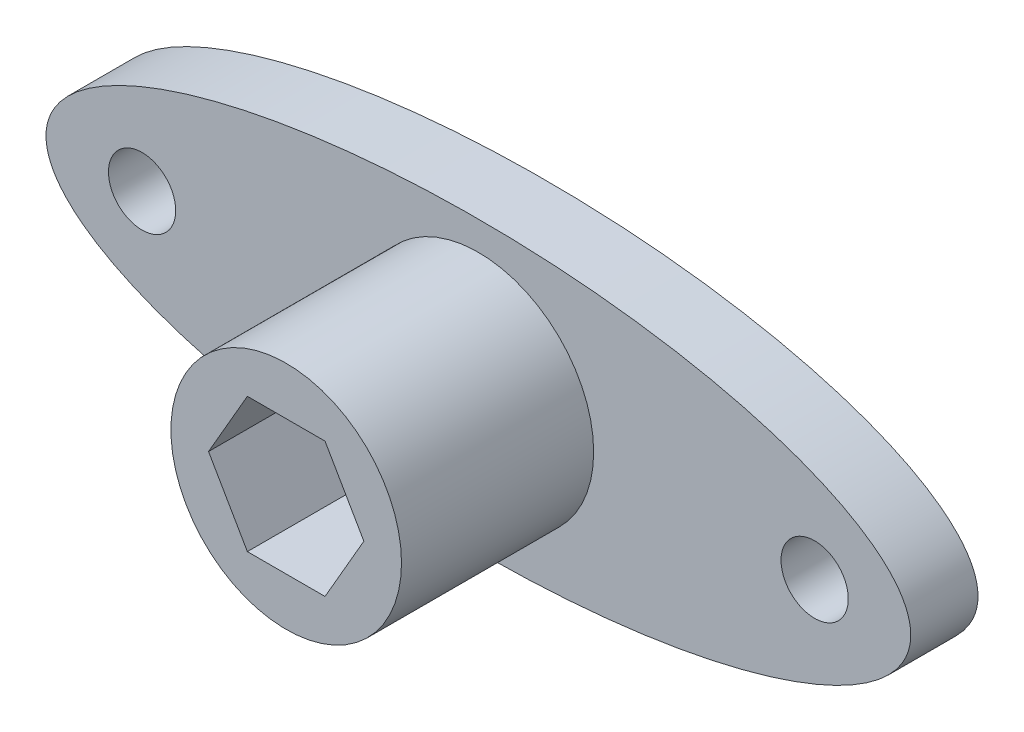
ISO-10303-21;
HEADER;
FILE_DESCRIPTION(('STEP AP214'),'2;1');
FILE_NAME('part.step','',(''),(''),'','','');
FILE_SCHEMA(('AUTOMOTIVE_DESIGN { 1 0 10303 214 1 1 1 1 }'));
ENDSEC;
DATA;
#1=APPLICATION_CONTEXT('core data for automotive mechanical design processes');
#2=APPLICATION_PROTOCOL_DEFINITION('international standard','automotive_design',2000,#1);
#3=PRODUCT_CONTEXT('',#1,'mechanical');
#4=PRODUCT('Part','Part','',(#3));
#5=PRODUCT_RELATED_PRODUCT_CATEGORY('part','',(#4));
#6=PRODUCT_DEFINITION_FORMATION('','',#4);
#7=PRODUCT_DEFINITION_CONTEXT('part definition',#1,'design');
#8=PRODUCT_DEFINITION('design','',#6,#7);
#9=PRODUCT_DEFINITION_SHAPE('','',#8);
#10=(LENGTH_UNIT() NAMED_UNIT(*) SI_UNIT(.MILLI.,.METRE.));
#11=(NAMED_UNIT(*) PLANE_ANGLE_UNIT() SI_UNIT($,.RADIAN.));
#12=(NAMED_UNIT(*) SI_UNIT($,.STERADIAN.) SOLID_ANGLE_UNIT());
#13=UNCERTAINTY_MEASURE_WITH_UNIT(LENGTH_MEASURE(1.E-05),#10,'distance_accuracy_value','');
#14=(GEOMETRIC_REPRESENTATION_CONTEXT(3) GLOBAL_UNCERTAINTY_ASSIGNED_CONTEXT((#13)) GLOBAL_UNIT_ASSIGNED_CONTEXT((#10,
#11,#12)) REPRESENTATION_CONTEXT('',''));
#15=CARTESIAN_POINT('',(0.,0.,0.));
#16=DIRECTION('',(0.,0.,1.));
#17=DIRECTION('',(1.,0.,0.));
#18=AXIS2_PLACEMENT_3D('',#15,#16,#17);
#19=CARTESIAN_POINT('',(0.,0.,3.5));
#20=DIRECTION('',(0.,0.,1.));
#21=DIRECTION('',(1.,0.,0.));
#22=AXIS2_PLACEMENT_3D('',#19,#20,#21);
#23=PLANE('',#22);
#24=CARTESIAN_POINT('',(0.,0.,3.5));
#25=DIRECTION('',(0.,0.,1.));
#26=DIRECTION('',(1.,0.,0.));
#27=AXIS2_PLACEMENT_3D('',#24,#25,#26);
#28=CIRCLE('',#27,6.);
#29=CARTESIAN_POINT('',(6.,0.,3.5));
#30=VERTEX_POINT('',#29);
#31=EDGE_CURVE('E160',#30,#30,#28,.T.);
#32=ORIENTED_EDGE('',*,*,#31,.F.);
#33=EDGE_LOOP('',(#32));
#34=FACE_BOUND('',#33,.T.);
#35=CARTESIAN_POINT('',(-17.5,0.,3.5));
#36=DIRECTION('',(0.,0.,1.));
#37=DIRECTION('',(1.,0.,0.));
#38=AXIS2_PLACEMENT_3D('',#35,#36,#37);
#39=CIRCLE('',#38,1.75);
#40=CARTESIAN_POINT('',(-15.75,0.,3.5));
#41=VERTEX_POINT('',#40);
#42=EDGE_CURVE('E186',#41,#41,#39,.T.);
#43=ORIENTED_EDGE('',*,*,#42,.F.);
#44=EDGE_LOOP('',(#43));
#45=FACE_BOUND('',#44,.T.);
#46=CARTESIAN_POINT('',(0.,0.,3.5));
#47=DIRECTION('',(0.,0.,1.));
#48=DIRECTION('',(1.,0.,0.));
#49=AXIS2_PLACEMENT_3D('',#46,#47,#48);
#50=ELLIPSE('',#49,22.5,7.5);
#51=CARTESIAN_POINT('',(22.5,0.,3.5));
#52=VERTEX_POINT('',#51);
#53=EDGE_CURVE('E11',#52,#52,#50,.T.);
#54=ORIENTED_EDGE('',*,*,#53,.T.);
#55=EDGE_LOOP('',(#54));
#56=FACE_BOUND('',#55,.T.);
#57=CARTESIAN_POINT('',(17.5,0.,3.5));
#58=DIRECTION('',(0.,0.,1.));
#59=DIRECTION('',(-1.,0.,0.));
#60=AXIS2_PLACEMENT_3D('',#57,#58,#59);
#61=CIRCLE('',#60,1.75);
#62=CARTESIAN_POINT('',(15.75,0.,3.5));
#63=VERTEX_POINT('',#62);
#64=EDGE_CURVE('E178',#63,#63,#61,.T.);
#65=ORIENTED_EDGE('',*,*,#64,.F.);
#66=EDGE_LOOP('',(#65));
#67=FACE_BOUND('',#66,.T.);
#68=ADVANCED_FACE('F45',(#34,#45,#56,#67),#23,.T.);
#69=CARTESIAN_POINT('',(0.,0.,0.));
#70=DIRECTION('',(0.,0.,1.));
#71=DIRECTION('',(1.,0.,0.));
#72=AXIS2_PLACEMENT_3D('',#69,#70,#71);
#73=PLANE('',#72);
#74=CARTESIAN_POINT('',(0.,0.,0.));
#75=DIRECTION('',(0.,0.,1.));
#76=DIRECTION('',(1.,0.,0.));
#77=AXIS2_PLACEMENT_3D('',#74,#75,#76);
#78=ELLIPSE('',#77,22.5,7.5);
#79=CARTESIAN_POINT('',(22.5,0.,0.));
#80=VERTEX_POINT('',#79);
#81=EDGE_CURVE('E50',#80,#80,#78,.T.);
#82=ORIENTED_EDGE('',*,*,#81,.F.);
#83=EDGE_LOOP('',(#82));
#84=FACE_BOUND('',#83,.T.);
#85=CARTESIAN_POINT('',(-17.5,0.,0.));
#86=DIRECTION('',(0.,0.,1.));
#87=DIRECTION('',(1.,0.,0.));
#88=AXIS2_PLACEMENT_3D('',#85,#86,#87);
#89=CIRCLE('',#88,1.75);
#90=CARTESIAN_POINT('',(-15.75,0.,0.));
#91=VERTEX_POINT('',#90);
#92=EDGE_CURVE('E182',#91,#91,#89,.T.);
#93=ORIENTED_EDGE('',*,*,#92,.T.);
#94=EDGE_LOOP('',(#93));
#95=FACE_BOUND('',#94,.T.);
#96=CARTESIAN_POINT('',(17.5,0.,0.));
#97=DIRECTION('',(0.,0.,1.));
#98=DIRECTION('',(-1.,0.,0.));
#99=AXIS2_PLACEMENT_3D('',#96,#97,#98);
#100=CIRCLE('',#99,1.75);
#101=CARTESIAN_POINT('',(15.75,0.,0.));
#102=VERTEX_POINT('',#101);
#103=EDGE_CURVE('E174',#102,#102,#100,.T.);
#104=ORIENTED_EDGE('',*,*,#103,.T.);
#105=EDGE_LOOP('',(#104));
#106=FACE_BOUND('',#105,.T.);
#107=ADVANCED_FACE('F195',(#84,#95,#106),#73,.F.);
#108=DIRECTION('',(0.,0.,-1.));
#109=VECTOR('',#108,1.);
#110=SURFACE_OF_LINEAR_EXTRUSION('',#50,#109);
#111=ORIENTED_EDGE('',*,*,#53,.F.);
#112=EDGE_LOOP('',(#111));
#113=FACE_BOUND('',#112,.T.);
#114=ORIENTED_EDGE('',*,*,#81,.T.);
#115=EDGE_LOOP('',(#114));
#116=FACE_BOUND('',#115,.T.);
#117=ADVANCED_FACE('F47',(#113,#116),#110,.F.);
#118=CARTESIAN_POINT('',(-17.5,0.,3.5));
#119=DIRECTION('',(0.,0.,-1.));
#120=DIRECTION('',(-1.,0.,0.));
#121=AXIS2_PLACEMENT_3D('',#118,#119,#120);
#122=CYLINDRICAL_SURFACE('',#121,1.75);
#123=ORIENTED_EDGE('',*,*,#42,.T.);
#124=EDGE_LOOP('',(#123));
#125=FACE_BOUND('',#124,.T.);
#126=ORIENTED_EDGE('',*,*,#92,.F.);
#127=EDGE_LOOP('',(#126));
#128=FACE_BOUND('',#127,.T.);
#129=ADVANCED_FACE('F198',(#125,#128),#122,.F.);
#130=CARTESIAN_POINT('',(17.5,0.,3.5));
#131=DIRECTION('',(0.,0.,-1.));
#132=DIRECTION('',(-1.,0.,0.));
#133=AXIS2_PLACEMENT_3D('',#130,#131,#132);
#134=CYLINDRICAL_SURFACE('',#133,1.75);
#135=ORIENTED_EDGE('',*,*,#64,.T.);
#136=EDGE_LOOP('',(#135));
#137=FACE_BOUND('',#136,.T.);
#138=ORIENTED_EDGE('',*,*,#103,.F.);
#139=EDGE_LOOP('',(#138));
#140=FACE_BOUND('',#139,.T.);
#141=ADVANCED_FACE('F200',(#137,#140),#134,.F.);
#142=CARTESIAN_POINT('',(0.,0.,13.5));
#143=DIRECTION('',(0.,0.,-1.));
#144=DIRECTION('',(-1.,0.,0.));
#145=AXIS2_PLACEMENT_3D('',#142,#143,#144);
#146=CYLINDRICAL_SURFACE('',#145,6.);
#147=CARTESIAN_POINT('',(0.,0.,13.5));
#148=DIRECTION('',(0.,0.,1.));
#149=DIRECTION('',(1.,0.,0.));
#150=AXIS2_PLACEMENT_3D('',#147,#148,#149);
#151=CIRCLE('',#150,6.);
#152=CARTESIAN_POINT('',(6.,0.,13.5));
#153=VERTEX_POINT('',#152);
#154=EDGE_CURVE('E170',#153,#153,#151,.T.);
#155=ORIENTED_EDGE('',*,*,#154,.F.);
#156=EDGE_LOOP('',(#155));
#157=FACE_BOUND('',#156,.T.);
#158=ORIENTED_EDGE('',*,*,#31,.T.);
#159=EDGE_LOOP('',(#158));
#160=FACE_BOUND('',#159,.T.);
#161=ADVANCED_FACE('F207',(#157,#160),#146,.T.);
#162=CARTESIAN_POINT('',(0.,0.,13.5));
#163=DIRECTION('',(0.,0.,1.));
#164=DIRECTION('',(1.,0.,0.));
#165=AXIS2_PLACEMENT_3D('',#162,#163,#164);
#166=PLANE('',#165);
#167=DIRECTION('',(1.,0.,0.));
#168=VECTOR('',#167,1.);
#169=CARTESIAN_POINT('',(-2.02072594216369,-3.5,13.5));
#170=LINE('',#169,#168);
#171=CARTESIAN_POINT('',(-2.02072594216369,-3.5,13.5));
#172=VERTEX_POINT('',#171);
#173=CARTESIAN_POINT('',(2.02072594216369,-3.5,13.5));
#174=VERTEX_POINT('',#173);
#175=EDGE_CURVE('E61',#172,#174,#170,.T.);
#176=ORIENTED_EDGE('',*,*,#175,.F.);
#177=DIRECTION('',(0.5,-0.866025403784439,0.));
#178=VECTOR('',#177,1.);
#179=CARTESIAN_POINT('',(-4.04145188432738,0.,13.5));
#180=LINE('',#179,#178);
#181=CARTESIAN_POINT('',(-4.04145188432738,0.,13.5));
#182=VERTEX_POINT('',#181);
#183=EDGE_CURVE('E154',#182,#172,#180,.T.);
#184=ORIENTED_EDGE('',*,*,#183,.F.);
#185=DIRECTION('',(-0.5,-0.866025403784439,0.));
#186=VECTOR('',#185,1.);
#187=CARTESIAN_POINT('',(-2.02072594216369,3.5,13.5));
#188=LINE('',#187,#186);
#189=CARTESIAN_POINT('',(-2.02072594216369,3.5,13.5));
#190=VERTEX_POINT('',#189);
#191=EDGE_CURVE('E151',#190,#182,#188,.T.);
#192=ORIENTED_EDGE('',*,*,#191,.F.);
#193=DIRECTION('',(-1.,0.,0.));
#194=VECTOR('',#193,1.);
#195=CARTESIAN_POINT('',(2.02072594216369,3.5,13.5));
#196=LINE('',#195,#194);
#197=CARTESIAN_POINT('',(2.02072594216369,3.5,13.5));
#198=VERTEX_POINT('',#197);
#199=EDGE_CURVE('E109',#198,#190,#196,.T.);
#200=ORIENTED_EDGE('',*,*,#199,.F.);
#201=DIRECTION('',(-0.5,0.866025403784439,0.));
#202=VECTOR('',#201,1.);
#203=CARTESIAN_POINT('',(4.04145188432738,0.,13.5));
#204=LINE('',#203,#202);
#205=CARTESIAN_POINT('',(4.04145188432738,0.,13.5));
#206=VERTEX_POINT('',#205);
#207=EDGE_CURVE('E145',#206,#198,#204,.T.);
#208=ORIENTED_EDGE('',*,*,#207,.F.);
#209=DIRECTION('',(0.5,0.866025403784439,0.));
#210=VECTOR('',#209,1.);
#211=CARTESIAN_POINT('',(2.02072594216369,-3.5,13.5));
#212=LINE('',#211,#210);
#213=EDGE_CURVE('E141',#174,#206,#212,.T.);
#214=ORIENTED_EDGE('',*,*,#213,.F.);
#215=EDGE_LOOP('',(#176,#184,#192,#200,#208,#214));
#216=FACE_BOUND('',#215,.T.);
#217=ORIENTED_EDGE('',*,*,#154,.T.);
#218=EDGE_LOOP('',(#217));
#219=FACE_BOUND('',#218,.T.);
#220=ADVANCED_FACE('F233',(#216,#219),#166,.T.);
#221=CARTESIAN_POINT('',(-2.02072594216369,-3.5,7.));
#222=DIRECTION('',(0.,-1.,0.));
#223=DIRECTION('',(1.,0.,0.));
#224=AXIS2_PLACEMENT_3D('',#221,#222,#223);
#225=PLANE('',#224);
#226=ORIENTED_EDGE('',*,*,#175,.T.);
#227=DIRECTION('',(0.,0.,1.));
#228=VECTOR('',#227,1.);
#229=CARTESIAN_POINT('',(2.02072594216369,-3.5,7.));
#230=LINE('',#229,#228);
#231=CARTESIAN_POINT('',(2.02072594216369,-3.5,7.));
#232=VERTEX_POINT('',#231);
#233=EDGE_CURVE('E91',#232,#174,#230,.T.);
#234=ORIENTED_EDGE('',*,*,#233,.F.);
#235=DIRECTION('',(1.,0.,0.));
#236=VECTOR('',#235,1.);
#237=CARTESIAN_POINT('',(-2.02072594216369,-3.5,7.));
#238=LINE('',#237,#236);
#239=CARTESIAN_POINT('',(-2.02072594216369,-3.5,7.));
#240=VERTEX_POINT('',#239);
#241=EDGE_CURVE('E157',#240,#232,#238,.T.);
#242=ORIENTED_EDGE('',*,*,#241,.F.);
#243=DIRECTION('',(0.,0.,1.));
#244=VECTOR('',#243,1.);
#245=CARTESIAN_POINT('',(-2.02072594216369,-3.5,7.));
#246=LINE('',#245,#244);
#247=EDGE_CURVE('E69',#240,#172,#246,.T.);
#248=ORIENTED_EDGE('',*,*,#247,.T.);
#249=EDGE_LOOP('',(#226,#234,#242,#248));
#250=FACE_BOUND('',#249,.T.);
#251=ADVANCED_FACE('F239',(#250),#225,.F.);
#252=CARTESIAN_POINT('',(-4.04145188432738,0.,7.));
#253=DIRECTION('',(-0.866025403784439,-0.5,0.));
#254=DIRECTION('',(0.5,-0.866025403784439,0.));
#255=AXIS2_PLACEMENT_3D('',#252,#253,#254);
#256=PLANE('',#255);
#257=ORIENTED_EDGE('',*,*,#183,.T.);
#258=ORIENTED_EDGE('',*,*,#247,.F.);
#259=DIRECTION('',(0.5,-0.866025403784439,0.));
#260=VECTOR('',#259,1.);
#261=CARTESIAN_POINT('',(-4.04145188432738,0.,7.));
#262=LINE('',#261,#260);
#263=CARTESIAN_POINT('',(-4.04145188432738,0.,7.));
#264=VERTEX_POINT('',#263);
#265=EDGE_CURVE('E123',#264,#240,#262,.T.);
#266=ORIENTED_EDGE('',*,*,#265,.F.);
#267=DIRECTION('',(0.,0.,1.));
#268=VECTOR('',#267,1.);
#269=CARTESIAN_POINT('',(-4.04145188432738,0.,7.));
#270=LINE('',#269,#268);
#271=EDGE_CURVE('E114',#264,#182,#270,.T.);
#272=ORIENTED_EDGE('',*,*,#271,.T.);
#273=EDGE_LOOP('',(#257,#258,#266,#272));
#274=FACE_BOUND('',#273,.T.);
#275=ADVANCED_FACE('F246',(#274),#256,.F.);
#276=CARTESIAN_POINT('',(-2.02072594216369,3.5,7.));
#277=DIRECTION('',(-0.866025403784439,0.5,0.));
#278=DIRECTION('',(-0.5,-0.866025403784439,0.));
#279=AXIS2_PLACEMENT_3D('',#276,#277,#278);
#280=PLANE('',#279);
#281=ORIENTED_EDGE('',*,*,#191,.T.);
#282=ORIENTED_EDGE('',*,*,#271,.F.);
#283=DIRECTION('',(-0.5,-0.866025403784439,0.));
#284=VECTOR('',#283,1.);
#285=CARTESIAN_POINT('',(-2.02072594216369,3.5,7.));
#286=LINE('',#285,#284);
#287=CARTESIAN_POINT('',(-2.02072594216369,3.5,7.));
#288=VERTEX_POINT('',#287);
#289=EDGE_CURVE('E118',#288,#264,#286,.T.);
#290=ORIENTED_EDGE('',*,*,#289,.F.);
#291=DIRECTION('',(0.,0.,1.));
#292=VECTOR('',#291,1.);
#293=CARTESIAN_POINT('',(-2.02072594216369,3.5,7.));
#294=LINE('',#293,#292);
#295=EDGE_CURVE('E102',#288,#190,#294,.T.);
#296=ORIENTED_EDGE('',*,*,#295,.T.);
#297=EDGE_LOOP('',(#281,#282,#290,#296));
#298=FACE_BOUND('',#297,.T.);
#299=ADVANCED_FACE('F119',(#298),#280,.F.);
#300=CARTESIAN_POINT('',(2.02072594216369,3.5,7.));
#301=DIRECTION('',(0.,1.,0.));
#302=DIRECTION('',(0.,0.,1.));
#303=AXIS2_PLACEMENT_3D('',#300,#301,#302);
#304=PLANE('',#303);
#305=ORIENTED_EDGE('',*,*,#199,.T.);
#306=ORIENTED_EDGE('',*,*,#295,.F.);
#307=DIRECTION('',(-1.,0.,0.));
#308=VECTOR('',#307,1.);
#309=CARTESIAN_POINT('',(2.02072594216369,3.5,7.));
#310=LINE('',#309,#308);
#311=CARTESIAN_POINT('',(2.02072594216369,3.5,7.));
#312=VERTEX_POINT('',#311);
#313=EDGE_CURVE('E106',#312,#288,#310,.T.);
#314=ORIENTED_EDGE('',*,*,#313,.F.);
#315=DIRECTION('',(0.,0.,1.));
#316=VECTOR('',#315,1.);
#317=CARTESIAN_POINT('',(2.02072594216369,3.5,7.));
#318=LINE('',#317,#316);
#319=EDGE_CURVE('E115',#312,#198,#318,.T.);
#320=ORIENTED_EDGE('',*,*,#319,.T.);
#321=EDGE_LOOP('',(#305,#306,#314,#320));
#322=FACE_BOUND('',#321,.T.);
#323=ADVANCED_FACE('F104',(#322),#304,.F.);
#324=CARTESIAN_POINT('',(4.04145188432738,0.,7.));
#325=DIRECTION('',(0.866025403784439,0.5,0.));
#326=DIRECTION('',(-0.5,0.866025403784439,0.));
#327=AXIS2_PLACEMENT_3D('',#324,#325,#326);
#328=PLANE('',#327);
#329=ORIENTED_EDGE('',*,*,#207,.T.);
#330=ORIENTED_EDGE('',*,*,#319,.F.);
#331=DIRECTION('',(-0.5,0.866025403784439,0.));
#332=VECTOR('',#331,1.);
#333=CARTESIAN_POINT('',(4.04145188432738,0.,7.));
#334=LINE('',#333,#332);
#335=CARTESIAN_POINT('',(4.04145188432738,0.,7.));
#336=VERTEX_POINT('',#335);
#337=EDGE_CURVE('E129',#336,#312,#334,.T.);
#338=ORIENTED_EDGE('',*,*,#337,.F.);
#339=DIRECTION('',(0.,0.,1.));
#340=VECTOR('',#339,1.);
#341=CARTESIAN_POINT('',(4.04145188432738,0.,7.));
#342=LINE('',#341,#340);
#343=EDGE_CURVE('E165',#336,#206,#342,.T.);
#344=ORIENTED_EDGE('',*,*,#343,.T.);
#345=EDGE_LOOP('',(#329,#330,#338,#344));
#346=FACE_BOUND('',#345,.T.);
#347=ADVANCED_FACE('F250',(#346),#328,.F.);
#348=CARTESIAN_POINT('',(2.02072594216369,-3.5,7.));
#349=DIRECTION('',(0.866025403784439,-0.5,0.));
#350=DIRECTION('',(0.5,0.866025403784439,0.));
#351=AXIS2_PLACEMENT_3D('',#348,#349,#350);
#352=PLANE('',#351);
#353=ORIENTED_EDGE('',*,*,#213,.T.);
#354=ORIENTED_EDGE('',*,*,#343,.F.);
#355=DIRECTION('',(0.5,0.866025403784439,0.));
#356=VECTOR('',#355,1.);
#357=CARTESIAN_POINT('',(2.02072594216369,-3.5,7.));
#358=LINE('',#357,#356);
#359=EDGE_CURVE('E133',#232,#336,#358,.T.);
#360=ORIENTED_EDGE('',*,*,#359,.F.);
#361=ORIENTED_EDGE('',*,*,#233,.T.);
#362=EDGE_LOOP('',(#353,#354,#360,#361));
#363=FACE_BOUND('',#362,.T.);
#364=ADVANCED_FACE('F247',(#363),#352,.F.);
#365=CARTESIAN_POINT('',(0.,0.,7.));
#366=DIRECTION('',(0.,0.,1.));
#367=DIRECTION('',(1.,0.,0.));
#368=AXIS2_PLACEMENT_3D('',#365,#366,#367);
#369=PLANE('',#368);
#370=ORIENTED_EDGE('',*,*,#241,.T.);
#371=ORIENTED_EDGE('',*,*,#359,.T.);
#372=ORIENTED_EDGE('',*,*,#337,.T.);
#373=ORIENTED_EDGE('',*,*,#313,.T.);
#374=ORIENTED_EDGE('',*,*,#289,.T.);
#375=ORIENTED_EDGE('',*,*,#265,.T.);
#376=EDGE_LOOP('',(#370,#371,#372,#373,#374,#375));
#377=FACE_BOUND('',#376,.T.);
#378=ADVANCED_FACE('F126',(#377),#369,.T.);
#379=CLOSED_SHELL('',(#68,#107,#117,#129,#141,#161,#220,#251,#275,#299,#323,#347,#364,#378));
#380=MANIFOLD_SOLID_BREP('B2',#379);
#381=ADVANCED_BREP_SHAPE_REPRESENTATION('',(#18,#380),#14);
#382=SHAPE_DEFINITION_REPRESENTATION(#9,#381);
ENDSEC;
END-ISO-10303-21;
